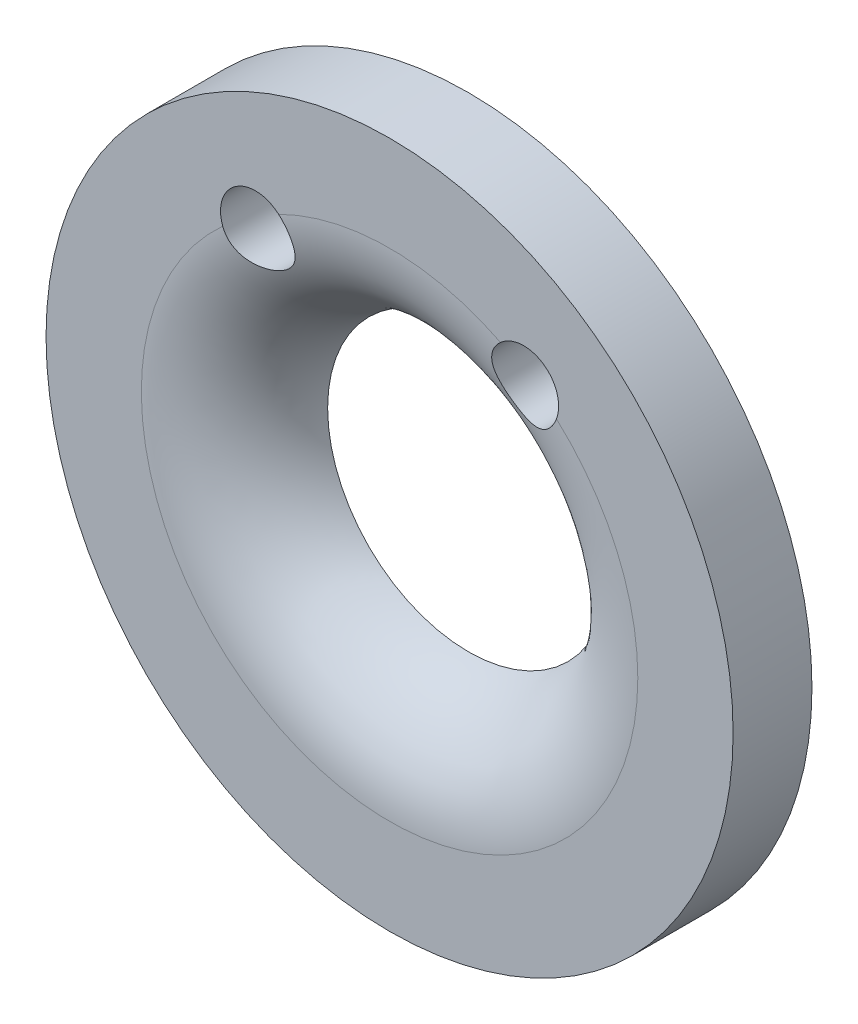
ISO-10303-21;
HEADER;
FILE_DESCRIPTION(('STEP AP214'),'2;1');
FILE_NAME('part.step','',(''),(''),'','','');
FILE_SCHEMA(('AUTOMOTIVE_DESIGN { 1 0 10303 214 1 1 1 1 }'));
ENDSEC;
DATA;
#1=APPLICATION_CONTEXT('core data for automotive mechanical design processes');
#2=APPLICATION_PROTOCOL_DEFINITION('international standard','automotive_design',2000,#1);
#3=PRODUCT_CONTEXT('',#1,'mechanical');
#4=PRODUCT('Part','Part','',(#3));
#5=PRODUCT_RELATED_PRODUCT_CATEGORY('part','',(#4));
#6=PRODUCT_DEFINITION_FORMATION('','',#4);
#7=PRODUCT_DEFINITION_CONTEXT('part definition',#1,'design');
#8=PRODUCT_DEFINITION('design','',#6,#7);
#9=PRODUCT_DEFINITION_SHAPE('','',#8);
#10=(LENGTH_UNIT() NAMED_UNIT(*) SI_UNIT(.MILLI.,.METRE.));
#11=(NAMED_UNIT(*) PLANE_ANGLE_UNIT() SI_UNIT($,.RADIAN.));
#12=(NAMED_UNIT(*) SI_UNIT($,.STERADIAN.) SOLID_ANGLE_UNIT());
#13=UNCERTAINTY_MEASURE_WITH_UNIT(LENGTH_MEASURE(1.E-05),#10,'distance_accuracy_value','');
#14=(GEOMETRIC_REPRESENTATION_CONTEXT(3) GLOBAL_UNCERTAINTY_ASSIGNED_CONTEXT((#13)) GLOBAL_UNIT_ASSIGNED_CONTEXT((#10,
#11,#12)) REPRESENTATION_CONTEXT('',''));
#15=CARTESIAN_POINT('',(0.,0.,0.));
#16=DIRECTION('',(0.,0.,1.));
#17=DIRECTION('',(1.,0.,0.));
#18=AXIS2_PLACEMENT_3D('',#15,#16,#17);
#19=CARTESIAN_POINT('',(0.,0.,7.));
#20=DIRECTION('',(0.,0.,1.));
#21=DIRECTION('',(1.,0.,0.));
#22=AXIS2_PLACEMENT_3D('',#19,#20,#21);
#23=PLANE('',#22);
#24=CARTESIAN_POINT('',(0.,0.,7.));
#25=DIRECTION('',(0.,0.,1.));
#26=DIRECTION('',(1.,0.,0.));
#27=AXIS2_PLACEMENT_3D('',#24,#25,#26);
#28=CIRCLE('',#27,30.5);
#29=CARTESIAN_POINT('',(30.5,0.,7.));
#30=VERTEX_POINT('',#29);
#31=EDGE_CURVE('E85',#30,#30,#28,.T.);
#32=ORIENTED_EDGE('',*,*,#31,.T.);
#33=EDGE_LOOP('',(#32));
#34=FACE_BOUND('',#33,.T.);
#35=CARTESIAN_POINT('',(11.9074329192095,17.394401462496,7.));
#36=DIRECTION('',(0.,0.,1.));
#37=DIRECTION('',(1.,0.,0.));
#38=AXIS2_PLACEMENT_3D('',#35,#36,#37);
#39=CIRCLE('',#38,3.1);
#40=CARTESIAN_POINT('',(9.85184475566959,19.7148663516754,7.));
#41=VERTEX_POINT('',#40);
#42=CARTESIAN_POINT('',(14.8144416573344,16.3176934257165,7.));
#43=VERTEX_POINT('',#42);
#44=EDGE_CURVE('E74',#41,#43,#39,.F.);
#45=ORIENTED_EDGE('',*,*,#44,.T.);
#46=CARTESIAN_POINT('',(0.,0.,7.));
#47=DIRECTION('',(0.,0.,1.));
#48=DIRECTION('',(1.,0.,0.));
#49=AXIS2_PLACEMENT_3D('',#46,#47,#48);
#50=CIRCLE('',#49,22.0393920141695);
#51=CARTESIAN_POINT('',(-14.8144416573344,16.3176934257165,7.));
#52=VERTEX_POINT('',#51);
#53=EDGE_CURVE('E79',#43,#52,#50,.F.);
#54=ORIENTED_EDGE('',*,*,#53,.T.);
#55=CARTESIAN_POINT('',(-11.9074329192095,17.394401462496,7.));
#56=DIRECTION('',(0.,0.,1.));
#57=DIRECTION('',(1.,0.,0.));
#58=AXIS2_PLACEMENT_3D('',#55,#56,#57);
#59=CIRCLE('',#58,3.1);
#60=CARTESIAN_POINT('',(-9.8518447556696,19.7148663516754,7.));
#61=VERTEX_POINT('',#60);
#62=EDGE_CURVE('E122',#61,#52,#59,.T.);
#63=ORIENTED_EDGE('',*,*,#62,.F.);
#64=CARTESIAN_POINT('',(0.,0.,7.));
#65=DIRECTION('',(0.,0.,1.));
#66=DIRECTION('',(1.,0.,0.));
#67=AXIS2_PLACEMENT_3D('',#64,#65,#66);
#68=CIRCLE('',#67,22.0393920141695);
#69=EDGE_CURVE('E76',#61,#41,#68,.F.);
#70=ORIENTED_EDGE('',*,*,#69,.T.);
#71=EDGE_LOOP('',(#45,#54,#63,#70));
#72=FACE_BOUND('',#71,.T.);
#73=ADVANCED_FACE('F39',(#34,#72),#23,.T.);
#74=CARTESIAN_POINT('',(0.,0.,0.));
#75=DIRECTION('',(0.,0.,1.));
#76=DIRECTION('',(1.,0.,0.));
#77=AXIS2_PLACEMENT_3D('',#74,#75,#76);
#78=PLANE('',#77);
#79=CARTESIAN_POINT('',(-11.9074329192095,17.394401462496,0.));
#80=DIRECTION('',(0.,0.,1.));
#81=DIRECTION('',(1.,0.,0.));
#82=AXIS2_PLACEMENT_3D('',#79,#80,#81);
#83=CIRCLE('',#82,3.1);
#84=CARTESIAN_POINT('',(-8.80743291920955,17.394401462496,0.));
#85=VERTEX_POINT('',#84);
#86=EDGE_CURVE('E118',#85,#85,#83,.T.);
#87=ORIENTED_EDGE('',*,*,#86,.T.);
#88=EDGE_LOOP('',(#87));
#89=FACE_BOUND('',#88,.T.);
#90=CARTESIAN_POINT('',(11.9074329192095,17.394401462496,0.));
#91=DIRECTION('',(0.,0.,1.));
#92=DIRECTION('',(1.,0.,0.));
#93=AXIS2_PLACEMENT_3D('',#90,#91,#92);
#94=CIRCLE('',#93,3.1);
#95=CARTESIAN_POINT('',(15.0074329192095,17.394401462496,0.));
#96=VERTEX_POINT('',#95);
#97=EDGE_CURVE('E80',#96,#96,#94,.F.);
#98=ORIENTED_EDGE('',*,*,#97,.F.);
#99=EDGE_LOOP('',(#98));
#100=FACE_BOUND('',#99,.T.);
#101=CARTESIAN_POINT('',(0.,0.,0.));
#102=DIRECTION('',(0.,0.,1.));
#103=DIRECTION('',(1.,0.,0.));
#104=AXIS2_PLACEMENT_3D('',#101,#102,#103);
#105=CIRCLE('',#104,30.5);
#106=CARTESIAN_POINT('',(30.5,0.,0.));
#107=VERTEX_POINT('',#106);
#108=EDGE_CURVE('E111',#107,#107,#105,.T.);
#109=ORIENTED_EDGE('',*,*,#108,.F.);
#110=EDGE_LOOP('',(#109));
#111=FACE_BOUND('',#110,.T.);
#112=CARTESIAN_POINT('',(0.,0.,0.));
#113=DIRECTION('',(0.,0.,1.));
#114=DIRECTION('',(1.,0.,0.));
#115=AXIS2_PLACEMENT_3D('',#112,#113,#114);
#116=CIRCLE('',#115,12.5);
#117=CARTESIAN_POINT('',(12.5,0.,0.));
#118=VERTEX_POINT('',#117);
#119=EDGE_CURVE('E119',#118,#118,#116,.T.);
#120=ORIENTED_EDGE('',*,*,#119,.T.);
#121=EDGE_LOOP('',(#120));
#122=FACE_BOUND('',#121,.T.);
#123=ADVANCED_FACE('F101',(#89,#100,#111,#122),#78,.F.);
#124=CARTESIAN_POINT('',(0.,0.,7.));
#125=DIRECTION('',(0.,0.,-1.));
#126=DIRECTION('',(-1.,0.,0.));
#127=AXIS2_PLACEMENT_3D('',#124,#125,#126);
#128=CYLINDRICAL_SURFACE('',#127,30.5);
#129=ORIENTED_EDGE('',*,*,#31,.F.);
#130=EDGE_LOOP('',(#129));
#131=FACE_BOUND('',#130,.T.);
#132=ORIENTED_EDGE('',*,*,#108,.T.);
#133=EDGE_LOOP('',(#132));
#134=FACE_BOUND('',#133,.T.);
#135=ADVANCED_FACE('F100',(#131,#134),#128,.T.);
#136=CARTESIAN_POINT('',(11.9074329192095,17.394401462496,0.));
#137=DIRECTION('',(0.,0.,1.));
#138=DIRECTION('',(1.,0.,0.));
#139=AXIS2_PLACEMENT_3D('',#136,#137,#138);
#140=CYLINDRICAL_SURFACE('',#139,3.1);
#141=ORIENTED_EDGE('',*,*,#97,.T.);
#142=EDGE_LOOP('',(#141));
#143=FACE_BOUND('',#142,.T.);
#144=ORIENTED_EDGE('',*,*,#44,.F.);
#145=CARTESIAN_POINT('',(9.85184475566959,19.7148663516754,7.));
#146=CARTESIAN_POINT('',(9.78883866064189,19.6590658336061,7.00000732987422));
#147=CARTESIAN_POINT('',(9.72811960190089,19.6006854355788,6.9990857428665));
#148=CARTESIAN_POINT('',(9.61165705396387,19.4792218705408,6.99526633342251));
#149=CARTESIAN_POINT('',(9.55591332702804,19.4161389284998,6.99236860547083));
#150=CARTESIAN_POINT('',(9.44990166248928,19.2858506720878,6.98448632977031));
#151=CARTESIAN_POINT('',(9.39962312431199,19.2186537482314,6.97950591612135));
#152=CARTESIAN_POINT('',(9.30476373802658,19.0805629179737,6.96741017641631));
#153=CARTESIAN_POINT('',(9.26018274078879,19.0096691084047,6.96029490625512));
#154=CARTESIAN_POINT('',(9.13539932830358,18.7921520472767,6.93570688710903));
#155=CARTESIAN_POINT('',(9.06411147005353,18.640637626277,6.9149886753618));
#156=CARTESIAN_POINT('',(8.94711548343325,18.3293979130243,6.86554647641895));
#157=CARTESIAN_POINT('',(8.90140861099083,18.1696722180497,6.83682209625501));
#158=CARTESIAN_POINT('',(8.83562342722687,17.8438518897077,6.77238385847812));
#159=CARTESIAN_POINT('',(8.81593531461909,17.6776979287536,6.73657264720261));
#160=CARTESIAN_POINT('',(8.80335716731163,17.345350203251,6.66056328764278));
#161=CARTESIAN_POINT('',(8.8104808381068,17.1791564617808,6.62036290592446));
#162=CARTESIAN_POINT('',(8.8522257456839,16.8408632868303,6.53618025179983));
#163=CARTESIAN_POINT('',(8.88840990063917,16.6689764147122,6.49211360384538));
#164=CARTESIAN_POINT('',(8.9894820840252,16.3331140347925,6.40651336963194));
#165=CARTESIAN_POINT('',(9.05437892198491,16.1691409722176,6.36498056525201));
#166=CARTESIAN_POINT('',(9.21335711257652,15.8503008992666,6.28835593439225));
#167=CARTESIAN_POINT('',(9.30795028586633,15.6956551481343,6.25339573154734));
#168=CARTESIAN_POINT('',(9.52401692468054,15.4038766527507,6.19578963909046));
#169=CARTESIAN_POINT('',(9.6454617197058,15.2667254733516,6.17313070344994));
#170=CARTESIAN_POINT('',(9.89993753795521,15.0263112510574,6.14511764695204));
#171=CARTESIAN_POINT('',(10.0310040226398,14.9211268283408,6.13841436369409));
#172=CARTESIAN_POINT('',(10.3083735203885,14.7333814886046,6.13933127082497));
#173=CARTESIAN_POINT('',(10.4546720440757,14.6508139315631,6.14694725208639));
#174=CARTESIAN_POINT('',(10.7466013829807,14.5157765793539,6.17429844065853));
#175=CARTESIAN_POINT('',(10.8915234951882,14.4615692349722,6.19312264130705));
#176=CARTESIAN_POINT('',(11.1864290021018,14.3755001565598,6.23982419832683));
#177=CARTESIAN_POINT('',(11.3364137573484,14.3436444802666,6.26770400595134));
#178=CARTESIAN_POINT('',(11.6476767658103,14.3010632627751,6.33160507260576));
#179=CARTESIAN_POINT('',(11.8090701331226,14.2917989391999,6.36802924717667));
#180=CARTESIAN_POINT('',(12.1305710637918,14.2982596661741,6.44430699566783));
#181=CARTESIAN_POINT('',(12.2906778510696,14.3139988059626,6.48416249113732));
#182=CARTESIAN_POINT('',(12.6220848773153,14.3727662924355,6.56788983197155));
#183=CARTESIAN_POINT('',(12.7929411802316,14.4183216885752,6.611771900184));
#184=CARTESIAN_POINT('',(13.125212048836,14.5381418990304,6.69577740362291));
#185=CARTESIAN_POINT('',(13.2866282346991,14.612401770149,6.73590148453508));
#186=CARTESIAN_POINT('',(13.5967007238839,14.7889588702525,6.8095589907123));
#187=CARTESIAN_POINT('',(13.7452649443249,14.8914394296132,6.84304677003258));
#188=CARTESIAN_POINT('',(13.953717738573,15.0639718026999,6.88640195925328));
#189=CARTESIAN_POINT('',(14.0208339248135,15.1246539469316,6.89971268861909));
#190=CARTESIAN_POINT('',(14.1497120859537,15.2518876246501,6.92389868204597));
#191=CARTESIAN_POINT('',(14.2114764450646,15.3184365175959,6.93477503406392));
#192=CARTESIAN_POINT('',(14.328400389818,15.4561078098542,6.95388680427266));
#193=CARTESIAN_POINT('',(14.383628118048,15.5271683928878,6.96215131907692));
#194=CARTESIAN_POINT('',(14.4877995041955,15.6739914441706,6.97620038777915));
#195=CARTESIAN_POINT('',(14.5367430256342,15.7497540144834,6.98198488782319));
#196=CARTESIAN_POINT('',(14.6280179930439,15.9055809293479,6.99114194284699));
#197=CARTESIAN_POINT('',(14.6703308672244,15.9856565412389,6.99450781468126));
#198=CARTESIAN_POINT('',(14.7478259515856,16.1492567489877,6.99894219316289));
#199=CARTESIAN_POINT('',(14.7830075285358,16.2327816503366,7.00001049587619));
#200=CARTESIAN_POINT('',(14.8144416573344,16.3176934257165,7.));
#201=B_SPLINE_CURVE_WITH_KNOTS('',3,(#145,#146,#147,#148,#149,#150,#151,#152,#153,#154,#155,
#156,#157,#158,#159,#160,#161,#162,#163,#164,#165,#166,#167,#168,#169,#170,#171,#172,#173,#174,
#175,#176,#177,#178,#179,#180,#181,#182,#183,#184,#185,#186,#187,#188,#189,#190,#191,#192,#193,
#194,#195,#196,#197,#198,#199,#200),.UNSPECIFIED.,.F.,.F.,(4,2,2,2,2,2,2,2,2,2,2,2,2,2,2,2,2,2,
2,2,2,2,2,2,2,2,2,4),(0.,0.252411535417351,0.504811003211025,0.756711822333978,1.00860604675554,
1.51218252941456,2.01578373356997,2.52685474123669,3.03818703074496,3.57902367989272,
4.12002638192206,4.67091888681803,5.22122599922692,5.72303129252105,6.22468910392491,
6.69026774759164,7.15597252345374,7.65108306818366,8.14647270247495,8.69048965199294,
9.23441295807358,9.78195669022445,10.0560109172637,10.3299424200322,10.6007048826059,
10.8714732245306,11.1429869052725,11.4145246847911),.UNSPECIFIED.);
#202=EDGE_CURVE('E11',#41,#43,#201,.T.);
#203=ORIENTED_EDGE('',*,*,#202,.T.);
#204=EDGE_LOOP('',(#144,#203));
#205=FACE_BOUND('',#204,.T.);
#206=ADVANCED_FACE('F71',(#143,#205),#140,.F.);
#207=CARTESIAN_POINT('',(-11.9074329192095,17.394401462496,0.));
#208=DIRECTION('',(0.,0.,1.));
#209=DIRECTION('',(1.,0.,0.));
#210=AXIS2_PLACEMENT_3D('',#207,#208,#209);
#211=CYLINDRICAL_SURFACE('',#210,3.1);
#212=ORIENTED_EDGE('',*,*,#86,.F.);
#213=EDGE_LOOP('',(#212));
#214=FACE_BOUND('',#213,.T.);
#215=ORIENTED_EDGE('',*,*,#62,.T.);
#216=CARTESIAN_POINT('',(-14.8144416573344,16.3176934257165,7.));
#217=CARTESIAN_POINT('',(-14.7852191255829,16.2387661841236,7.00000732987422));
#218=CARTESIAN_POINT('',(-14.7527640025529,16.1610375538942,6.9990857428665));
#219=CARTESIAN_POINT('',(-14.681669329598,16.0085171612211,6.99526633342251));
#220=CARTESIAN_POINT('',(-14.6430300754205,15.9337252585454,6.99236860547083));
#221=CARTESIAN_POINT('',(-14.5599272197711,15.7877546513669,6.98448632977031));
#222=CARTESIAN_POINT('',(-14.5154752758844,15.7165691004333,6.97950591612135));
#223=CARTESIAN_POINT('',(-14.4210633190678,15.578171979879,6.96741017641631));
#224=CARTESIAN_POINT('',(-14.3711034503681,15.5109603062691,6.96029490625512));
#225=CARTESIAN_POINT('',(-14.2134740370305,15.3159281551656,6.93570688710903));
#226=CARTESIAN_POINT('',(-14.0980192012344,15.1946484808749,6.9149886753618));
#227=CARTESIAN_POINT('',(-13.8501995653606,14.9729648142095,6.86554647641895));
#228=CARTESIAN_POINT('',(-13.7178339354198,14.8725618469527,6.83682209625501));
#229=CARTESIAN_POINT('',(-13.4378921765997,14.6933435765882,6.77238385847812));
#230=CARTESIAN_POINT('',(-13.2901195557313,14.6148705682322,6.73657264720261));
#231=CARTESIAN_POINT('',(-12.9848409611968,14.4828925391685,6.66056328764278));
#232=CARTESIAN_POINT('',(-12.8273300500386,14.4294003036982,6.62036290592446));
#233=CARTESIAN_POINT('',(-12.4968533332908,14.345913483096,6.53618025179983));
#234=CARTESIAN_POINT('',(-12.3235201823839,14.317452831785,6.49211360384538));
#235=CARTESIAN_POINT('',(-11.9738434021744,14.2901531269875,6.40651336963194));
#236=CARTESIAN_POINT('',(-11.7974988649054,14.2913231708925,6.36498056525201));
#237=CARTESIAN_POINT('',(-11.4427391459005,14.3241652015058,6.28835593439225));
#238=CARTESIAN_POINT('',(-11.2643450420045,14.3563943881457,6.25339573154734));
#239=CARTESIAN_POINT('',(-10.9141572640684,14.4522484593209,6.19578963909046));
#240=CARTESIAN_POINT('',(-10.7423567776801,14.5158399455912,6.17313070344994));
#241=CARTESIAN_POINT('',(-10.4261556696573,14.6660857430039,6.14511764695204));
#242=CARTESIAN_POINT('',(-10.2806746716491,14.7502134162649,6.13841436369409));
#243=CARTESIAN_POINT('',(-10.0052903639694,14.9408587255641,6.13933127082497));
#244=CARTESIAN_POINT('',(-9.87538248854096,15.0473697738668,6.14694725208638));
#245=CARTESIAN_POINT('',(-9.64386683750371,15.2706595603103,6.17429844065852));
#246=CARTESIAN_POINT('',(-9.5408956666241,15.3861489224147,6.19312264130705));
#247=CARTESIAN_POINT('',(-9.35395361680836,15.6299312316118,6.23982419832683));
#248=CARTESIAN_POINT('',(-9.26998789289214,15.7582276389102,6.26770400595134));
#249=CARTESIAN_POINT('',(-9.11766863687438,16.0329942030442,6.33160507260575));
#250=CARTESIAN_POINT('',(-9.05063566714706,16.1801003812736,6.36802924717666));
#251=CARTESIAN_POINT('',(-8.94033119874815,16.4821558623783,6.44430699566782));
#252=CARTESIAN_POINT('',(-8.89707311551328,16.637109539613,6.48416249113731));
#253=CARTESIAN_POINT('',(-8.83194710767225,16.9673258893204,6.56788983197155));
#254=CARTESIAN_POINT('',(-8.81259564143066,17.1430890570148,6.61177190018399));
#255=CARTESIAN_POINT('',(-8.80407320477396,17.4962011936373,6.6957774036229));
#256=CARTESIAN_POINT('',(-8.81489703986364,17.6735498843883,6.73590148453507));
#257=CARTESIAN_POINT('',(-8.86729927245003,18.026496571816,6.80955899071229));
#258=CARTESIAN_POINT('',(-8.90908189687557,18.2020750583632,6.84304677003258));
#259=CARTESIAN_POINT('',(-8.9945007611947,18.4588309829515,6.88640195925328));
#260=CARTESIAN_POINT('',(-9.02678702876057,18.5433561390336,6.89971268861909));
#261=CARTESIAN_POINT('',(-9.09876856989013,18.7095387100248,6.92389868204597));
#262=CARTESIAN_POINT('',(-9.13846051915108,18.7911973921876,6.93477503406392));
#263=CARTESIAN_POINT('',(-9.22449782869188,18.9500122999757,6.95388680427266));
#264=CARTESIAN_POINT('',(-9.27076090524705,19.0272096844792,6.96215131907692));
#265=CARTESIAN_POINT('',(-9.3699441111937,19.1774474218757,6.97620038777914));
#266=CARTESIAN_POINT('',(-9.42286438511499,19.2504876844664,6.98198488782319));
#267=CARTESIAN_POINT('',(-9.53510766495634,19.3919606260569,6.99114194284699));
#268=CARTESIAN_POINT('',(-9.59444789456364,19.4603800684055,6.99450781468126));
#269=CARTESIAN_POINT('',(-9.71892371472242,19.5918193558024,6.99894219316289));
#270=CARTESIAN_POINT('',(-9.78405981918608,19.6548387210589,7.0000104958762));
#271=CARTESIAN_POINT('',(-9.85184475566959,19.7148663516754,7.));
#272=B_SPLINE_CURVE_WITH_KNOTS('',3,(#216,#217,#218,#219,#220,#221,#222,#223,#224,#225,#226,
#227,#228,#229,#230,#231,#232,#233,#234,#235,#236,#237,#238,#239,#240,#241,#242,#243,#244,#245,
#246,#247,#248,#249,#250,#251,#252,#253,#254,#255,#256,#257,#258,#259,#260,#261,#262,#263,#264,
#265,#266,#267,#268,#269,#270,#271),.UNSPECIFIED.,.F.,.F.,(4,2,2,2,2,2,2,2,2,2,2,2,2,2,2,2,2,2,
2,2,2,2,2,2,2,2,2,4),(0.,0.252411535417351,0.504811003211023,0.756711822333979,1.00860604675554,
1.51218252941456,2.01578373356996,2.52685474123669,3.03818703074496,3.57902367989271,
4.12002638192206,4.67091888681803,5.22122599922691,5.72303129252105,6.22468910392491,
6.69026774759163,7.15597252345374,7.65108306818366,8.14647270247494,8.69048965199294,
9.23441295807357,9.78195669022444,10.0560109172637,10.3299424200322,10.6007048826058,
10.8714732245306,11.1429869052725,11.4145246847911),.UNSPECIFIED.);
#273=EDGE_CURVE('E52',#52,#61,#272,.T.);
#274=ORIENTED_EDGE('',*,*,#273,.T.);
#275=EDGE_LOOP('',(#215,#274));
#276=FACE_BOUND('',#275,.T.);
#277=ADVANCED_FACE('F89',(#214,#276),#211,.F.);
#278=CARTESIAN_POINT('',(0.,0.,-3.));
#279=DIRECTION('',(0.,0.,1.));
#280=DIRECTION('',(1.,0.,0.));
#281=AXIS2_PLACEMENT_3D('',#278,#279,#280);
#282=TOROIDAL_SURFACE('',#281,22.0393920141695,10.);
#283=ORIENTED_EDGE('',*,*,#273,.F.);
#284=ORIENTED_EDGE('',*,*,#53,.F.);
#285=ORIENTED_EDGE('',*,*,#202,.F.);
#286=ORIENTED_EDGE('',*,*,#69,.F.);
#287=EDGE_LOOP('',(#283,#284,#285,#286));
#288=FACE_BOUND('',#287,.T.);
#289=ORIENTED_EDGE('',*,*,#119,.F.);
#290=EDGE_LOOP('',(#289));
#291=FACE_BOUND('',#290,.T.);
#292=ADVANCED_FACE('F41',(#288,#291),#282,.T.);
#293=CLOSED_SHELL('',(#73,#123,#135,#206,#277,#292));
#294=MANIFOLD_SOLID_BREP('B2',#293);
#295=ADVANCED_BREP_SHAPE_REPRESENTATION('',(#18,#294),#14);
#296=SHAPE_DEFINITION_REPRESENTATION(#9,#295);
ENDSEC;
END-ISO-10303-21;
